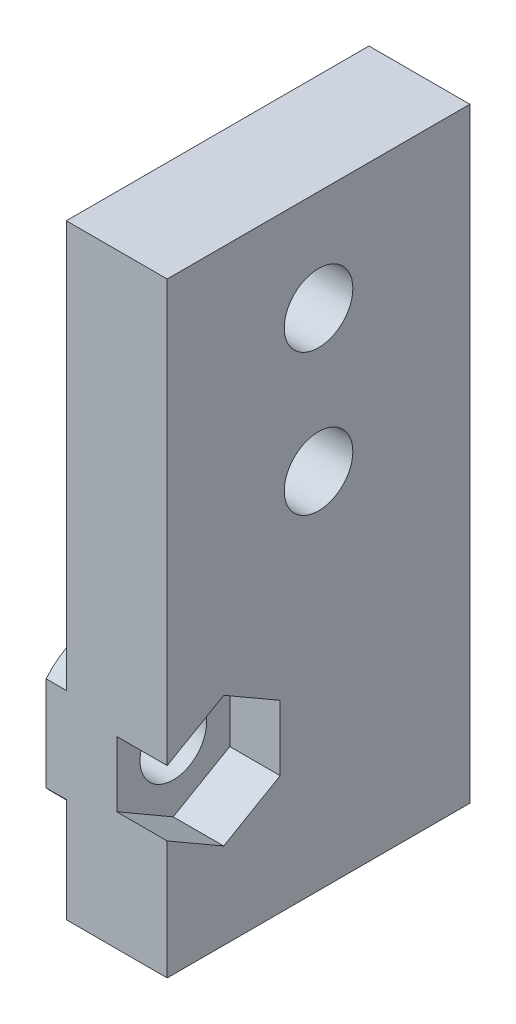
ISO-10303-21;
HEADER;
FILE_DESCRIPTION(('STEP AP214'),'2;1');
FILE_NAME('part.step','',(''),(''),'','','');
FILE_SCHEMA(('AUTOMOTIVE_DESIGN { 1 0 10303 214 1 1 1 1 }'));
ENDSEC;
DATA;
#1=APPLICATION_CONTEXT('core data for automotive mechanical design processes');
#2=APPLICATION_PROTOCOL_DEFINITION('international standard','automotive_design',2000,#1);
#3=PRODUCT_CONTEXT('',#1,'mechanical');
#4=PRODUCT('Part','Part','',(#3));
#5=PRODUCT_RELATED_PRODUCT_CATEGORY('part','',(#4));
#6=PRODUCT_DEFINITION_FORMATION('','',#4);
#7=PRODUCT_DEFINITION_CONTEXT('part definition',#1,'design');
#8=PRODUCT_DEFINITION('design','',#6,#7);
#9=PRODUCT_DEFINITION_SHAPE('','',#8);
#10=(LENGTH_UNIT() NAMED_UNIT(*) SI_UNIT(.MILLI.,.METRE.));
#11=(NAMED_UNIT(*) PLANE_ANGLE_UNIT() SI_UNIT($,.RADIAN.));
#12=(NAMED_UNIT(*) SI_UNIT($,.STERADIAN.) SOLID_ANGLE_UNIT());
#13=UNCERTAINTY_MEASURE_WITH_UNIT(LENGTH_MEASURE(1.E-05),#10,'distance_accuracy_value','');
#14=(GEOMETRIC_REPRESENTATION_CONTEXT(3) GLOBAL_UNCERTAINTY_ASSIGNED_CONTEXT((#13)) GLOBAL_UNIT_ASSIGNED_CONTEXT((#10,
#11,#12)) REPRESENTATION_CONTEXT('',''));
#15=CARTESIAN_POINT('',(0.,0.,0.));
#16=DIRECTION('',(0.,0.,1.));
#17=DIRECTION('',(1.,0.,0.));
#18=AXIS2_PLACEMENT_3D('',#15,#16,#17);
#19=CARTESIAN_POINT('',(2.5,0.,0.));
#20=DIRECTION('',(1.,0.,0.));
#21=DIRECTION('',(0.,0.,-1.));
#22=AXIS2_PLACEMENT_3D('',#19,#20,#21);
#23=PLANE('',#22);
#24=CARTESIAN_POINT('',(2.5,18.,-7.5));
#25=DIRECTION('',(1.,0.,0.));
#26=DIRECTION('',(0.,0.,-1.));
#27=AXIS2_PLACEMENT_3D('',#24,#25,#26);
#28=CIRCLE('',#27,1.7);
#29=CARTESIAN_POINT('',(2.5,18.,-9.2));
#30=VERTEX_POINT('',#29);
#31=EDGE_CURVE('E266',#30,#30,#28,.T.);
#32=ORIENTED_EDGE('',*,*,#31,.F.);
#33=EDGE_LOOP('',(#32));
#34=FACE_BOUND('',#33,.T.);
#35=CARTESIAN_POINT('',(2.5,25.,-7.5));
#36=DIRECTION('',(1.,0.,0.));
#37=DIRECTION('',(0.,0.,-1.));
#38=AXIS2_PLACEMENT_3D('',#35,#36,#37);
#39=CIRCLE('',#38,1.7);
#40=CARTESIAN_POINT('',(2.5,25.,-9.2));
#41=VERTEX_POINT('',#40);
#42=EDGE_CURVE('E280',#41,#41,#39,.T.);
#43=ORIENTED_EDGE('',*,*,#42,.F.);
#44=EDGE_LOOP('',(#43));
#45=FACE_BOUND('',#44,.T.);
#46=DIRECTION('',(0.,0.5,-0.866025403784438));
#47=VECTOR('',#46,1.);
#48=CARTESIAN_POINT('',(2.5,4.26683849253807,-2.8));
#49=LINE('',#48,#47);
#50=CARTESIAN_POINT('',(2.5,4.26683849253807,-2.8));
#51=VERTEX_POINT('',#50);
#52=CARTESIAN_POINT('',(2.5,5.88341924626903,-5.60000000000002));
#53=VERTEX_POINT('',#52);
#54=EDGE_CURVE('E232',#51,#53,#49,.T.);
#55=ORIENTED_EDGE('',*,*,#54,.F.);
#56=DIRECTION('',(0.,-0.5,-0.866025403784438));
#57=VECTOR('',#56,1.);
#58=CARTESIAN_POINT('',(2.5,5.88341924626903,0.));
#59=LINE('',#58,#57);
#60=CARTESIAN_POINT('',(2.5,5.88341924626903,0.));
#61=VERTEX_POINT('',#60);
#62=EDGE_CURVE('E230',#61,#51,#59,.T.);
#63=ORIENTED_EDGE('',*,*,#62,.F.);
#64=DIRECTION('',(0.,1.,0.));
#65=VECTOR('',#64,1.);
#66=CARTESIAN_POINT('',(2.5,0.,0.));
#67=LINE('',#66,#65);
#68=CARTESIAN_POINT('',(2.5,0.,0.));
#69=VERTEX_POINT('',#68);
#70=EDGE_CURVE('E273',#69,#61,#67,.T.);
#71=ORIENTED_EDGE('',*,*,#70,.F.);
#72=DIRECTION('',(0.,0.,-1.));
#73=VECTOR('',#72,1.);
#74=CARTESIAN_POINT('',(2.5,0.,0.));
#75=LINE('',#74,#73);
#76=CARTESIAN_POINT('',(2.5,0.,-15.));
#77=VERTEX_POINT('',#76);
#78=EDGE_CURVE('E276',#69,#77,#75,.T.);
#79=ORIENTED_EDGE('',*,*,#78,.T.);
#80=DIRECTION('',(0.,1.,0.));
#81=VECTOR('',#80,1.);
#82=CARTESIAN_POINT('',(2.5,0.,-15.));
#83=LINE('',#82,#81);
#84=CARTESIAN_POINT('',(2.5,30.,-15.));
#85=VERTEX_POINT('',#84);
#86=EDGE_CURVE('E278',#77,#85,#83,.T.);
#87=ORIENTED_EDGE('',*,*,#86,.T.);
#88=DIRECTION('',(0.,0.,-1.));
#89=VECTOR('',#88,1.);
#90=CARTESIAN_POINT('',(2.5,30.,0.));
#91=LINE('',#90,#89);
#92=CARTESIAN_POINT('',(2.5,30.,0.));
#93=VERTEX_POINT('',#92);
#94=EDGE_CURVE('E269',#93,#85,#91,.T.);
#95=ORIENTED_EDGE('',*,*,#94,.F.);
#96=CARTESIAN_POINT('',(2.5,9.11658075373096,0.));
#97=VERTEX_POINT('',#96);
#98=EDGE_CURVE('E272',#97,#93,#67,.T.);
#99=ORIENTED_EDGE('',*,*,#98,.F.);
#100=DIRECTION('',(0.,-0.5,0.866025403784439));
#101=VECTOR('',#100,1.);
#102=CARTESIAN_POINT('',(2.5,10.7331615074619,-2.8));
#103=LINE('',#102,#101);
#104=CARTESIAN_POINT('',(2.5,10.7331615074619,-2.8));
#105=VERTEX_POINT('',#104);
#106=EDGE_CURVE('E118',#105,#97,#103,.T.);
#107=ORIENTED_EDGE('',*,*,#106,.F.);
#108=DIRECTION('',(0.,0.5,0.866025403784439));
#109=VECTOR('',#108,1.);
#110=CARTESIAN_POINT('',(2.5,9.11658075373097,-5.60000000000002));
#111=LINE('',#110,#109);
#112=CARTESIAN_POINT('',(2.5,9.11658075373097,-5.60000000000002));
#113=VERTEX_POINT('',#112);
#114=EDGE_CURVE('E237',#113,#105,#111,.T.);
#115=ORIENTED_EDGE('',*,*,#114,.F.);
#116=DIRECTION('',(0.,1.,0.));
#117=VECTOR('',#116,1.);
#118=CARTESIAN_POINT('',(2.5,5.88341924626903,-5.60000000000002));
#119=LINE('',#118,#117);
#120=EDGE_CURVE('E235',#53,#113,#119,.T.);
#121=ORIENTED_EDGE('',*,*,#120,.F.);
#122=EDGE_LOOP('',(#55,#63,#71,#79,#87,#95,#99,#107,#115,#121));
#123=FACE_BOUND('',#122,.T.);
#124=ADVANCED_FACE('F95',(#34,#45,#123),#23,.T.);
#125=CARTESIAN_POINT('',(2.5,0.,0.));
#126=DIRECTION('',(0.,0.,1.));
#127=DIRECTION('',(1.,0.,0.));
#128=AXIS2_PLACEMENT_3D('',#125,#126,#127);
#129=PLANE('',#128);
#130=DIRECTION('',(-1.,0.,0.));
#131=VECTOR('',#130,1.);
#132=CARTESIAN_POINT('',(2.5,30.,0.));
#133=LINE('',#132,#131);
#134=CARTESIAN_POINT('',(-2.5,30.,0.));
#135=VERTEX_POINT('',#134);
#136=EDGE_CURVE('E12',#93,#135,#133,.T.);
#137=ORIENTED_EDGE('',*,*,#136,.T.);
#138=DIRECTION('',(0.,1.,0.));
#139=VECTOR('',#138,1.);
#140=CARTESIAN_POINT('',(-2.5,0.,0.));
#141=LINE('',#140,#139);
#142=CARTESIAN_POINT('',(-2.5,9.84147389479362,0.));
#143=VERTEX_POINT('',#142);
#144=EDGE_CURVE('E201',#143,#135,#141,.T.);
#145=ORIENTED_EDGE('',*,*,#144,.F.);
#146=DIRECTION('',(1.,0.,0.));
#147=VECTOR('',#146,1.);
#148=CARTESIAN_POINT('',(-3.5,9.84147389479362,0.));
#149=LINE('',#148,#147);
#150=CARTESIAN_POINT('',(-3.5,9.84147389479362,0.));
#151=VERTEX_POINT('',#150);
#152=EDGE_CURVE('E189',#151,#143,#149,.T.);
#153=ORIENTED_EDGE('',*,*,#152,.F.);
#154=DIRECTION('',(0.,1.,0.));
#155=VECTOR('',#154,1.);
#156=CARTESIAN_POINT('',(-3.5,0.,0.));
#157=LINE('',#156,#155);
#158=CARTESIAN_POINT('',(-3.5,5.15852610520638,0.));
#159=VERTEX_POINT('',#158);
#160=EDGE_CURVE('E194',#159,#151,#157,.T.);
#161=ORIENTED_EDGE('',*,*,#160,.F.);
#162=DIRECTION('',(1.,0.,0.));
#163=VECTOR('',#162,1.);
#164=CARTESIAN_POINT('',(-3.5,5.15852610520638,0.));
#165=LINE('',#164,#163);
#166=CARTESIAN_POINT('',(-2.5,5.15852610520638,0.));
#167=VERTEX_POINT('',#166);
#168=EDGE_CURVE('E191',#159,#167,#165,.T.);
#169=ORIENTED_EDGE('',*,*,#168,.T.);
#170=CARTESIAN_POINT('',(-2.5,0.,0.));
#171=VERTEX_POINT('',#170);
#172=EDGE_CURVE('E214',#171,#167,#141,.T.);
#173=ORIENTED_EDGE('',*,*,#172,.F.);
#174=DIRECTION('',(-1.,0.,0.));
#175=VECTOR('',#174,1.);
#176=CARTESIAN_POINT('',(2.5,0.,0.));
#177=LINE('',#176,#175);
#178=EDGE_CURVE('E103',#69,#171,#177,.T.);
#179=ORIENTED_EDGE('',*,*,#178,.F.);
#180=ORIENTED_EDGE('',*,*,#70,.T.);
#181=DIRECTION('',(-1.,0.,0.));
#182=VECTOR('',#181,1.);
#183=CARTESIAN_POINT('',(2.5,5.88341924626903,0.));
#184=LINE('',#183,#182);
#185=CARTESIAN_POINT('',(0.,5.88341924626903,0.));
#186=VERTEX_POINT('',#185);
#187=EDGE_CURVE('E263',#61,#186,#184,.T.);
#188=ORIENTED_EDGE('',*,*,#187,.T.);
#189=DIRECTION('',(0.,1.,0.));
#190=VECTOR('',#189,1.);
#191=CARTESIAN_POINT('',(0.,0.,0.));
#192=LINE('',#191,#190);
#193=CARTESIAN_POINT('',(0.,9.11658075373098,0.));
#194=VERTEX_POINT('',#193);
#195=EDGE_CURVE('E205',#186,#194,#192,.T.);
#196=ORIENTED_EDGE('',*,*,#195,.T.);
#197=DIRECTION('',(-1.,0.,0.));
#198=VECTOR('',#197,1.);
#199=CARTESIAN_POINT('',(2.5,9.11658075373096,0.));
#200=LINE('',#199,#198);
#201=EDGE_CURVE('E240',#97,#194,#200,.T.);
#202=ORIENTED_EDGE('',*,*,#201,.F.);
#203=ORIENTED_EDGE('',*,*,#98,.T.);
#204=EDGE_LOOP('',(#137,#145,#153,#161,#169,#173,#179,#180,#188,#196,#202,#203));
#205=FACE_BOUND('',#204,.T.);
#206=ADVANCED_FACE('F200',(#205),#129,.T.);
#207=CARTESIAN_POINT('',(2.5,30.,0.));
#208=DIRECTION('',(0.,1.,0.));
#209=DIRECTION('',(0.,0.,1.));
#210=AXIS2_PLACEMENT_3D('',#207,#208,#209);
#211=PLANE('',#210);
#212=DIRECTION('',(-1.,0.,0.));
#213=VECTOR('',#212,1.);
#214=CARTESIAN_POINT('',(2.5,30.,-15.));
#215=LINE('',#214,#213);
#216=CARTESIAN_POINT('',(-2.5,30.,-15.));
#217=VERTEX_POINT('',#216);
#218=EDGE_CURVE('E283',#85,#217,#215,.T.);
#219=ORIENTED_EDGE('',*,*,#218,.T.);
#220=DIRECTION('',(0.,0.,-1.));
#221=VECTOR('',#220,1.);
#222=CARTESIAN_POINT('',(-2.5,30.,0.));
#223=LINE('',#222,#221);
#224=EDGE_CURVE('E210',#135,#217,#223,.T.);
#225=ORIENTED_EDGE('',*,*,#224,.F.);
#226=ORIENTED_EDGE('',*,*,#136,.F.);
#227=ORIENTED_EDGE('',*,*,#94,.T.);
#228=EDGE_LOOP('',(#219,#225,#226,#227));
#229=FACE_BOUND('',#228,.T.);
#230=ADVANCED_FACE('F97',(#229),#211,.T.);
#231=CARTESIAN_POINT('',(2.5,0.,0.));
#232=DIRECTION('',(0.,1.,0.));
#233=DIRECTION('',(0.,0.,1.));
#234=AXIS2_PLACEMENT_3D('',#231,#232,#233);
#235=PLANE('',#234);
#236=ORIENTED_EDGE('',*,*,#178,.T.);
#237=DIRECTION('',(0.,0.,-1.));
#238=VECTOR('',#237,1.);
#239=CARTESIAN_POINT('',(-2.5,0.,0.));
#240=LINE('',#239,#238);
#241=CARTESIAN_POINT('',(-2.5,0.,-15.));
#242=VERTEX_POINT('',#241);
#243=EDGE_CURVE('E216',#171,#242,#240,.T.);
#244=ORIENTED_EDGE('',*,*,#243,.T.);
#245=DIRECTION('',(-1.,0.,0.));
#246=VECTOR('',#245,1.);
#247=CARTESIAN_POINT('',(2.5,0.,-15.));
#248=LINE('',#247,#246);
#249=EDGE_CURVE('E285',#77,#242,#248,.T.);
#250=ORIENTED_EDGE('',*,*,#249,.F.);
#251=ORIENTED_EDGE('',*,*,#78,.F.);
#252=EDGE_LOOP('',(#236,#244,#250,#251));
#253=FACE_BOUND('',#252,.T.);
#254=ADVANCED_FACE('F289',(#253),#235,.F.);
#255=CARTESIAN_POINT('',(2.5,25.,-7.5));
#256=DIRECTION('',(-1.,0.,0.));
#257=DIRECTION('',(0.,0.,1.));
#258=AXIS2_PLACEMENT_3D('',#255,#256,#257);
#259=CYLINDRICAL_SURFACE('',#258,1.7);
#260=ORIENTED_EDGE('',*,*,#42,.T.);
#261=EDGE_LOOP('',(#260));
#262=FACE_BOUND('',#261,.T.);
#263=CARTESIAN_POINT('',(-2.5,25.,-7.5));
#264=DIRECTION('',(1.,0.,0.));
#265=DIRECTION('',(0.,0.,-1.));
#266=AXIS2_PLACEMENT_3D('',#263,#264,#265);
#267=CIRCLE('',#266,1.7);
#268=CARTESIAN_POINT('',(-2.5,25.,-9.2));
#269=VERTEX_POINT('',#268);
#270=EDGE_CURVE('E222',#269,#269,#267,.T.);
#271=ORIENTED_EDGE('',*,*,#270,.F.);
#272=EDGE_LOOP('',(#271));
#273=FACE_BOUND('',#272,.T.);
#274=ADVANCED_FACE('F348',(#262,#273),#259,.F.);
#275=CARTESIAN_POINT('',(2.5,0.,-15.));
#276=DIRECTION('',(0.,0.,1.));
#277=DIRECTION('',(1.,0.,0.));
#278=AXIS2_PLACEMENT_3D('',#275,#276,#277);
#279=PLANE('',#278);
#280=ORIENTED_EDGE('',*,*,#249,.T.);
#281=DIRECTION('',(0.,1.,0.));
#282=VECTOR('',#281,1.);
#283=CARTESIAN_POINT('',(-2.5,0.,-15.));
#284=LINE('',#283,#282);
#285=EDGE_CURVE('E219',#242,#217,#284,.T.);
#286=ORIENTED_EDGE('',*,*,#285,.T.);
#287=ORIENTED_EDGE('',*,*,#218,.F.);
#288=ORIENTED_EDGE('',*,*,#86,.F.);
#289=EDGE_LOOP('',(#280,#286,#287,#288));
#290=FACE_BOUND('',#289,.T.);
#291=ADVANCED_FACE('F299',(#290),#279,.F.);
#292=CARTESIAN_POINT('',(2.5,18.,-7.5));
#293=DIRECTION('',(-1.,0.,0.));
#294=DIRECTION('',(0.,0.,1.));
#295=AXIS2_PLACEMENT_3D('',#292,#293,#294);
#296=CYLINDRICAL_SURFACE('',#295,1.7);
#297=ORIENTED_EDGE('',*,*,#31,.T.);
#298=EDGE_LOOP('',(#297));
#299=FACE_BOUND('',#298,.T.);
#300=CARTESIAN_POINT('',(-2.5,18.,-7.5));
#301=DIRECTION('',(1.,0.,0.));
#302=DIRECTION('',(0.,0.,-1.));
#303=AXIS2_PLACEMENT_3D('',#300,#301,#302);
#304=CIRCLE('',#303,1.7);
#305=CARTESIAN_POINT('',(-2.5,18.,-9.2));
#306=VERTEX_POINT('',#305);
#307=EDGE_CURVE('E202',#306,#306,#304,.T.);
#308=ORIENTED_EDGE('',*,*,#307,.F.);
#309=EDGE_LOOP('',(#308));
#310=FACE_BOUND('',#309,.T.);
#311=ADVANCED_FACE('F330',(#299,#310),#296,.F.);
#312=CARTESIAN_POINT('',(2.5,5.88341924626903,0.));
#313=DIRECTION('',(0.,0.866025403784438,-0.5));
#314=DIRECTION('',(0.,0.5,0.866025403784439));
#315=AXIS2_PLACEMENT_3D('',#312,#313,#314);
#316=PLANE('',#315);
#317=DIRECTION('',(0.,-0.5,-0.866025403784438));
#318=VECTOR('',#317,1.);
#319=CARTESIAN_POINT('',(0.,5.88341924626903,0.));
#320=LINE('',#319,#318);
#321=CARTESIAN_POINT('',(0.,4.26683849253807,-2.8));
#322=VERTEX_POINT('',#321);
#323=EDGE_CURVE('E225',#186,#322,#320,.T.);
#324=ORIENTED_EDGE('',*,*,#323,.F.);
#325=ORIENTED_EDGE('',*,*,#187,.F.);
#326=ORIENTED_EDGE('',*,*,#62,.T.);
#327=DIRECTION('',(-1.,0.,0.));
#328=VECTOR('',#327,1.);
#329=CARTESIAN_POINT('',(2.5,4.26683849253807,-2.8));
#330=LINE('',#329,#328);
#331=EDGE_CURVE('E261',#51,#322,#330,.T.);
#332=ORIENTED_EDGE('',*,*,#331,.T.);
#333=EDGE_LOOP('',(#324,#325,#326,#332));
#334=FACE_BOUND('',#333,.T.);
#335=ADVANCED_FACE('F328',(#334),#316,.T.);
#336=CARTESIAN_POINT('',(2.5,4.26683849253807,-2.8));
#337=DIRECTION('',(0.,0.866025403784438,0.5));
#338=DIRECTION('',(0.,-0.5,0.866025403784439));
#339=AXIS2_PLACEMENT_3D('',#336,#337,#338);
#340=PLANE('',#339);
#341=DIRECTION('',(0.,0.5,-0.866025403784438));
#342=VECTOR('',#341,1.);
#343=CARTESIAN_POINT('',(0.,4.26683849253807,-2.8));
#344=LINE('',#343,#342);
#345=CARTESIAN_POINT('',(0.,5.88341924626903,-5.60000000000002));
#346=VERTEX_POINT('',#345);
#347=EDGE_CURVE('E243',#322,#346,#344,.T.);
#348=ORIENTED_EDGE('',*,*,#347,.F.);
#349=ORIENTED_EDGE('',*,*,#331,.F.);
#350=ORIENTED_EDGE('',*,*,#54,.T.);
#351=DIRECTION('',(-1.,0.,0.));
#352=VECTOR('',#351,1.);
#353=CARTESIAN_POINT('',(2.5,5.88341924626903,-5.60000000000002));
#354=LINE('',#353,#352);
#355=EDGE_CURVE('E259',#53,#346,#354,.T.);
#356=ORIENTED_EDGE('',*,*,#355,.T.);
#357=EDGE_LOOP('',(#348,#349,#350,#356));
#358=FACE_BOUND('',#357,.T.);
#359=ADVANCED_FACE('F326',(#358),#340,.T.);
#360=CARTESIAN_POINT('',(2.5,5.88341924626903,-5.60000000000002));
#361=DIRECTION('',(0.,0.,1.));
#362=DIRECTION('',(1.,0.,0.));
#363=AXIS2_PLACEMENT_3D('',#360,#361,#362);
#364=PLANE('',#363);
#365=DIRECTION('',(0.,1.,0.));
#366=VECTOR('',#365,1.);
#367=CARTESIAN_POINT('',(0.,5.88341924626903,-5.60000000000002));
#368=LINE('',#367,#366);
#369=CARTESIAN_POINT('',(0.,9.11658075373097,-5.60000000000002));
#370=VERTEX_POINT('',#369);
#371=EDGE_CURVE('E246',#346,#370,#368,.T.);
#372=ORIENTED_EDGE('',*,*,#371,.F.);
#373=ORIENTED_EDGE('',*,*,#355,.F.);
#374=ORIENTED_EDGE('',*,*,#120,.T.);
#375=DIRECTION('',(-1.,0.,0.));
#376=VECTOR('',#375,1.);
#377=CARTESIAN_POINT('',(2.5,9.11658075373097,-5.60000000000002));
#378=LINE('',#377,#376);
#379=EDGE_CURVE('E257',#113,#370,#378,.T.);
#380=ORIENTED_EDGE('',*,*,#379,.T.);
#381=EDGE_LOOP('',(#372,#373,#374,#380));
#382=FACE_BOUND('',#381,.T.);
#383=ADVANCED_FACE('F322',(#382),#364,.T.);
#384=CARTESIAN_POINT('',(2.5,9.11658075373097,-5.60000000000002));
#385=DIRECTION('',(0.,-0.866025403784439,0.5));
#386=DIRECTION('',(0.,-0.5,-0.866025403784439));
#387=AXIS2_PLACEMENT_3D('',#384,#385,#386);
#388=PLANE('',#387);
#389=DIRECTION('',(0.,0.5,0.866025403784439));
#390=VECTOR('',#389,1.);
#391=CARTESIAN_POINT('',(0.,9.11658075373097,-5.60000000000002));
#392=LINE('',#391,#390);
#393=CARTESIAN_POINT('',(0.,10.7331615074619,-2.8));
#394=VERTEX_POINT('',#393);
#395=EDGE_CURVE('E249',#370,#394,#392,.T.);
#396=ORIENTED_EDGE('',*,*,#395,.F.);
#397=ORIENTED_EDGE('',*,*,#379,.F.);
#398=ORIENTED_EDGE('',*,*,#114,.T.);
#399=DIRECTION('',(-1.,0.,0.));
#400=VECTOR('',#399,1.);
#401=CARTESIAN_POINT('',(2.5,10.7331615074619,-2.8));
#402=LINE('',#401,#400);
#403=EDGE_CURVE('E255',#105,#394,#402,.T.);
#404=ORIENTED_EDGE('',*,*,#403,.T.);
#405=EDGE_LOOP('',(#396,#397,#398,#404));
#406=FACE_BOUND('',#405,.T.);
#407=ADVANCED_FACE('F319',(#406),#388,.T.);
#408=CARTESIAN_POINT('',(2.5,10.7331615074619,-2.8));
#409=DIRECTION('',(0.,-0.866025403784438,-0.5));
#410=DIRECTION('',(0.,0.5,-0.866025403784438));
#411=AXIS2_PLACEMENT_3D('',#408,#409,#410);
#412=PLANE('',#411);
#413=DIRECTION('',(0.,-0.5,0.866025403784439));
#414=VECTOR('',#413,1.);
#415=CARTESIAN_POINT('',(0.,10.7331615074619,-2.8));
#416=LINE('',#415,#414);
#417=EDGE_CURVE('E233',#394,#194,#416,.T.);
#418=ORIENTED_EDGE('',*,*,#417,.F.);
#419=ORIENTED_EDGE('',*,*,#403,.F.);
#420=ORIENTED_EDGE('',*,*,#106,.T.);
#421=ORIENTED_EDGE('',*,*,#201,.T.);
#422=EDGE_LOOP('',(#418,#419,#420,#421));
#423=FACE_BOUND('',#422,.T.);
#424=ADVANCED_FACE('F313',(#423),#412,.T.);
#425=CARTESIAN_POINT('',(-2.5,7.5,-2.8));
#426=DIRECTION('',(1.,0.,0.));
#427=DIRECTION('',(0.,0.,-1.));
#428=AXIS2_PLACEMENT_3D('',#425,#426,#427);
#429=CYLINDRICAL_SURFACE('',#428,1.65);
#430=CARTESIAN_POINT('',(0.,7.5,-2.8));
#431=DIRECTION('',(1.,0.,0.));
#432=DIRECTION('',(0.,0.,-1.));
#433=AXIS2_PLACEMENT_3D('',#430,#431,#432);
#434=CIRCLE('',#433,1.65);
#435=CARTESIAN_POINT('',(0.,7.5,-4.45));
#436=VERTEX_POINT('',#435);
#437=EDGE_CURVE('E213',#436,#436,#434,.T.);
#438=ORIENTED_EDGE('',*,*,#437,.T.);
#439=EDGE_LOOP('',(#438));
#440=FACE_BOUND('',#439,.T.);
#441=CARTESIAN_POINT('',(-3.5,7.5,-2.8));
#442=DIRECTION('',(-1.,0.,0.));
#443=DIRECTION('',(0.,0.,1.));
#444=AXIS2_PLACEMENT_3D('',#441,#442,#443);
#445=CIRCLE('',#444,1.65);
#446=CARTESIAN_POINT('',(-3.5,7.5,-1.15));
#447=VERTEX_POINT('',#446);
#448=EDGE_CURVE('E198',#447,#447,#445,.F.);
#449=ORIENTED_EDGE('',*,*,#448,.F.);
#450=EDGE_LOOP('',(#449));
#451=FACE_BOUND('',#450,.T.);
#452=ADVANCED_FACE('F377',(#440,#451),#429,.F.);
#453=CARTESIAN_POINT('',(-2.5,0.,0.));
#454=DIRECTION('',(1.,0.,0.));
#455=DIRECTION('',(0.,0.,-1.));
#456=AXIS2_PLACEMENT_3D('',#453,#454,#455);
#457=PLANE('',#456);
#458=CARTESIAN_POINT('',(-2.5,7.5,-2.8));
#459=DIRECTION('',(-1.,0.,0.));
#460=DIRECTION('',(0.,0.,1.));
#461=AXIS2_PLACEMENT_3D('',#458,#459,#460);
#462=CIRCLE('',#461,3.65);
#463=EDGE_CURVE('E110',#143,#167,#462,.T.);
#464=ORIENTED_EDGE('',*,*,#463,.F.);
#465=ORIENTED_EDGE('',*,*,#144,.T.);
#466=ORIENTED_EDGE('',*,*,#224,.T.);
#467=ORIENTED_EDGE('',*,*,#285,.F.);
#468=ORIENTED_EDGE('',*,*,#243,.F.);
#469=ORIENTED_EDGE('',*,*,#172,.T.);
#470=EDGE_LOOP('',(#464,#465,#466,#467,#468,#469));
#471=FACE_BOUND('',#470,.T.);
#472=ORIENTED_EDGE('',*,*,#307,.T.);
#473=EDGE_LOOP('',(#472));
#474=FACE_BOUND('',#473,.T.);
#475=ORIENTED_EDGE('',*,*,#270,.T.);
#476=EDGE_LOOP('',(#475));
#477=FACE_BOUND('',#476,.T.);
#478=ADVANCED_FACE('F294',(#471,#474,#477),#457,.F.);
#479=CARTESIAN_POINT('',(0.,0.,0.));
#480=DIRECTION('',(1.,0.,0.));
#481=DIRECTION('',(0.,0.,-1.));
#482=AXIS2_PLACEMENT_3D('',#479,#480,#481);
#483=PLANE('',#482);
#484=ORIENTED_EDGE('',*,*,#195,.F.);
#485=ORIENTED_EDGE('',*,*,#323,.T.);
#486=ORIENTED_EDGE('',*,*,#347,.T.);
#487=ORIENTED_EDGE('',*,*,#371,.T.);
#488=ORIENTED_EDGE('',*,*,#395,.T.);
#489=ORIENTED_EDGE('',*,*,#417,.T.);
#490=EDGE_LOOP('',(#484,#485,#486,#487,#488,#489));
#491=FACE_BOUND('',#490,.T.);
#492=ORIENTED_EDGE('',*,*,#437,.F.);
#493=EDGE_LOOP('',(#492));
#494=FACE_BOUND('',#493,.T.);
#495=ADVANCED_FACE('F309',(#491,#494),#483,.T.);
#496=CARTESIAN_POINT('',(-3.5,7.5,-2.8));
#497=DIRECTION('',(1.,0.,0.));
#498=DIRECTION('',(0.,0.,-1.));
#499=AXIS2_PLACEMENT_3D('',#496,#497,#498);
#500=CYLINDRICAL_SURFACE('',#499,3.65);
#501=ORIENTED_EDGE('',*,*,#463,.T.);
#502=ORIENTED_EDGE('',*,*,#168,.F.);
#503=CARTESIAN_POINT('',(-3.5,7.5,-2.8));
#504=DIRECTION('',(-1.,0.,0.));
#505=DIRECTION('',(0.,0.,1.));
#506=AXIS2_PLACEMENT_3D('',#503,#504,#505);
#507=CIRCLE('',#506,3.65);
#508=EDGE_CURVE('E185',#151,#159,#507,.T.);
#509=ORIENTED_EDGE('',*,*,#508,.F.);
#510=ORIENTED_EDGE('',*,*,#152,.T.);
#511=EDGE_LOOP('',(#501,#502,#509,#510));
#512=FACE_BOUND('',#511,.T.);
#513=ADVANCED_FACE('F187',(#512),#500,.T.);
#514=CARTESIAN_POINT('',(-3.5,0.,0.));
#515=DIRECTION('',(-1.,0.,0.));
#516=DIRECTION('',(0.,0.,1.));
#517=AXIS2_PLACEMENT_3D('',#514,#515,#516);
#518=PLANE('',#517);
#519=ORIENTED_EDGE('',*,*,#448,.T.);
#520=EDGE_LOOP('',(#519));
#521=FACE_BOUND('',#520,.T.);
#522=ORIENTED_EDGE('',*,*,#160,.T.);
#523=ORIENTED_EDGE('',*,*,#508,.T.);
#524=EDGE_LOOP('',(#522,#523));
#525=FACE_BOUND('',#524,.T.);
#526=ADVANCED_FACE('F196',(#521,#525),#518,.T.);
#527=CLOSED_SHELL('',(#124,#206,#230,#254,#274,#291,#311,#335,#359,#383,#407,#424,#452,#478,
#495,#513,#526));
#528=MANIFOLD_SOLID_BREP('B2',#527);
#529=ADVANCED_BREP_SHAPE_REPRESENTATION('',(#18,#528),#14);
#530=SHAPE_DEFINITION_REPRESENTATION(#9,#529);
ENDSEC;
END-ISO-10303-21;
